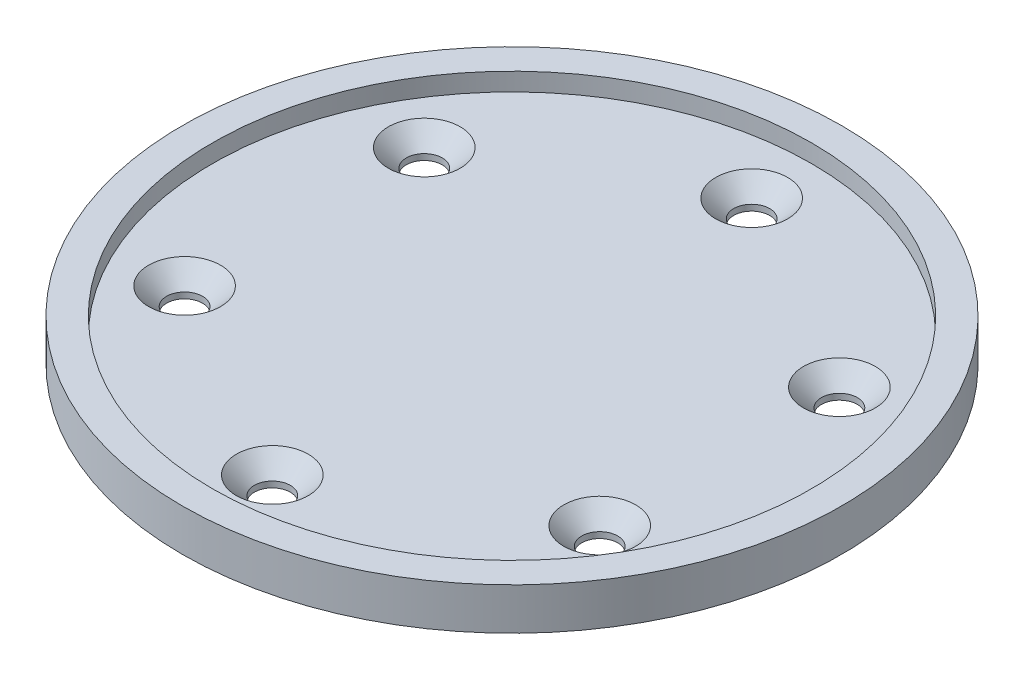
ISO-10303-21;
HEADER;
FILE_DESCRIPTION(('STEP AP214'),'2;1');
FILE_NAME('part.step','',(''),(''),'','','');
FILE_SCHEMA(('AUTOMOTIVE_DESIGN { 1 0 10303 214 1 1 1 1 }'));
ENDSEC;
DATA;
#1=APPLICATION_CONTEXT('core data for automotive mechanical design processes');
#2=APPLICATION_PROTOCOL_DEFINITION('international standard','automotive_design',2000,#1);
#3=PRODUCT_CONTEXT('',#1,'mechanical');
#4=PRODUCT('Part','Part','',(#3));
#5=PRODUCT_RELATED_PRODUCT_CATEGORY('part','',(#4));
#6=PRODUCT_DEFINITION_FORMATION('','',#4);
#7=PRODUCT_DEFINITION_CONTEXT('part definition',#1,'design');
#8=PRODUCT_DEFINITION('design','',#6,#7);
#9=PRODUCT_DEFINITION_SHAPE('','',#8);
#10=(LENGTH_UNIT() NAMED_UNIT(*) SI_UNIT(.MILLI.,.METRE.));
#11=(NAMED_UNIT(*) PLANE_ANGLE_UNIT() SI_UNIT($,.RADIAN.));
#12=(NAMED_UNIT(*) SI_UNIT($,.STERADIAN.) SOLID_ANGLE_UNIT());
#13=UNCERTAINTY_MEASURE_WITH_UNIT(LENGTH_MEASURE(1.E-05),#10,'distance_accuracy_value','');
#14=(GEOMETRIC_REPRESENTATION_CONTEXT(3) GLOBAL_UNCERTAINTY_ASSIGNED_CONTEXT((#13)) GLOBAL_UNIT_ASSIGNED_CONTEXT((#10,
#11,#12)) REPRESENTATION_CONTEXT('',''));
#15=CARTESIAN_POINT('',(0.,0.,0.));
#16=DIRECTION('',(0.,0.,1.));
#17=DIRECTION('',(1.,0.,0.));
#18=AXIS2_PLACEMENT_3D('',#15,#16,#17);
#19=CARTESIAN_POINT('',(50.,6.47864191507407,0.));
#20=DIRECTION('',(0.,1.,0.));
#21=DIRECTION('',(0.,0.,1.));
#22=AXIS2_PLACEMENT_3D('',#19,#20,#21);
#23=PLANE('',#22);
#24=CARTESIAN_POINT('',(0.,6.47864191507407,0.));
#25=DIRECTION('',(0.,-1.,0.));
#26=DIRECTION('',(0.,0.,-1.));
#27=AXIS2_PLACEMENT_3D('',#24,#25,#26);
#28=CIRCLE('',#27,50.);
#29=CARTESIAN_POINT('',(0.,6.47864191507407,-50.));
#30=VERTEX_POINT('',#29);
#31=EDGE_CURVE('E93',#30,#30,#28,.T.);
#32=ORIENTED_EDGE('',*,*,#31,.T.);
#33=EDGE_LOOP('',(#32));
#34=FACE_BOUND('',#33,.T.);
#35=CARTESIAN_POINT('',(0.,6.47864191507407,0.));
#36=DIRECTION('',(0.,-1.,0.));
#37=DIRECTION('',(0.,0.,-1.));
#38=AXIS2_PLACEMENT_3D('',#35,#36,#37);
#39=CIRCLE('',#38,55.);
#40=CARTESIAN_POINT('',(0.,6.47864191507407,-55.));
#41=VERTEX_POINT('',#40);
#42=EDGE_CURVE('E128',#41,#41,#39,.T.);
#43=ORIENTED_EDGE('',*,*,#42,.F.);
#44=EDGE_LOOP('',(#43));
#45=FACE_BOUND('',#44,.T.);
#46=ADVANCED_FACE('F50',(#34,#45),#23,.T.);
#47=CARTESIAN_POINT('',(0.,0.,0.));
#48=DIRECTION('',(0.,-1.,0.));
#49=DIRECTION('',(0.,0.,-1.));
#50=AXIS2_PLACEMENT_3D('',#47,#48,#49);
#51=CYLINDRICAL_SURFACE('',#50,50.);
#52=CARTESIAN_POINT('',(0.,3.47864191507407,0.));
#53=DIRECTION('',(0.,-1.,0.));
#54=DIRECTION('',(0.,0.,-1.));
#55=AXIS2_PLACEMENT_3D('',#52,#53,#54);
#56=CIRCLE('',#55,50.);
#57=CARTESIAN_POINT('',(0.,3.47864191507407,-50.));
#58=VERTEX_POINT('',#57);
#59=EDGE_CURVE('E140',#58,#58,#56,.T.);
#60=ORIENTED_EDGE('',*,*,#59,.T.);
#61=EDGE_LOOP('',(#60));
#62=FACE_BOUND('',#61,.T.);
#63=ORIENTED_EDGE('',*,*,#31,.F.);
#64=EDGE_LOOP('',(#63));
#65=FACE_BOUND('',#64,.T.);
#66=ADVANCED_FACE('F154',(#62,#65),#51,.F.);
#67=CARTESIAN_POINT('',(50.,3.47864191507406,0.));
#68=DIRECTION('',(0.,1.,0.));
#69=DIRECTION('',(0.,0.,1.));
#70=AXIS2_PLACEMENT_3D('',#67,#68,#69);
#71=PLANE('',#70);
#72=CARTESIAN_POINT('',(0.,3.47864191507406,-40.));
#73=DIRECTION('',(0.,1.,0.));
#74=DIRECTION('',(0.,0.,1.));
#75=AXIS2_PLACEMENT_3D('',#72,#73,#74);
#76=CIRCLE('',#75,6.00000000000001);
#77=CARTESIAN_POINT('',(0.,3.47864191507406,-34.));
#78=VERTEX_POINT('',#77);
#79=EDGE_CURVE('E114',#78,#78,#76,.F.);
#80=ORIENTED_EDGE('',*,*,#79,.T.);
#81=EDGE_LOOP('',(#80));
#82=FACE_BOUND('',#81,.T.);
#83=CARTESIAN_POINT('',(34.6410161513775,3.47864191507406,-20.));
#84=DIRECTION('',(0.,1.,0.));
#85=DIRECTION('',(0.,0.,1.));
#86=AXIS2_PLACEMENT_3D('',#83,#84,#85);
#87=CIRCLE('',#86,6.00000000000107);
#88=CARTESIAN_POINT('',(34.6410161513775,3.47864191507406,-13.9999999999989));
#89=VERTEX_POINT('',#88);
#90=EDGE_CURVE('E110',#89,#89,#87,.F.);
#91=ORIENTED_EDGE('',*,*,#90,.T.);
#92=EDGE_LOOP('',(#91));
#93=FACE_BOUND('',#92,.T.);
#94=CARTESIAN_POINT('',(34.6410161513776,3.47864191507406,20.));
#95=DIRECTION('',(0.,1.,0.));
#96=DIRECTION('',(0.,0.,1.));
#97=AXIS2_PLACEMENT_3D('',#94,#95,#96);
#98=CIRCLE('',#97,6.00000000000276);
#99=CARTESIAN_POINT('',(34.6410161513776,3.47864191507406,26.0000000000028));
#100=VERTEX_POINT('',#99);
#101=EDGE_CURVE('E106',#100,#100,#98,.F.);
#102=ORIENTED_EDGE('',*,*,#101,.T.);
#103=EDGE_LOOP('',(#102));
#104=FACE_BOUND('',#103,.T.);
#105=CARTESIAN_POINT('',(0.,3.47864191507406,40.));
#106=DIRECTION('',(0.,1.,0.));
#107=DIRECTION('',(0.,0.,1.));
#108=AXIS2_PLACEMENT_3D('',#105,#106,#107);
#109=CIRCLE('',#108,6.00000000000343);
#110=CARTESIAN_POINT('',(0.,3.47864191507406,46.0000000000034));
#111=VERTEX_POINT('',#110);
#112=EDGE_CURVE('E102',#111,#111,#109,.F.);
#113=ORIENTED_EDGE('',*,*,#112,.T.);
#114=EDGE_LOOP('',(#113));
#115=FACE_BOUND('',#114,.T.);
#116=CARTESIAN_POINT('',(-34.6410161513775,3.47864191507406,20.));
#117=DIRECTION('',(0.,1.,0.));
#118=DIRECTION('',(0.,0.,1.));
#119=AXIS2_PLACEMENT_3D('',#116,#117,#118);
#120=CIRCLE('',#119,6.00000000000236);
#121=CARTESIAN_POINT('',(-34.6410161513775,3.47864191507406,26.0000000000024));
#122=VERTEX_POINT('',#121);
#123=EDGE_CURVE('E98',#122,#122,#120,.F.);
#124=ORIENTED_EDGE('',*,*,#123,.T.);
#125=EDGE_LOOP('',(#124));
#126=FACE_BOUND('',#125,.T.);
#127=CARTESIAN_POINT('',(-34.6410161513776,3.47864191507406,-20.));
#128=DIRECTION('',(0.,1.,0.));
#129=DIRECTION('',(0.,0.,1.));
#130=AXIS2_PLACEMENT_3D('',#127,#128,#129);
#131=CIRCLE('',#130,6.00000000000069);
#132=CARTESIAN_POINT('',(-34.6410161513776,3.47864191507406,-13.9999999999993));
#133=VERTEX_POINT('',#132);
#134=EDGE_CURVE('E92',#133,#133,#131,.F.);
#135=ORIENTED_EDGE('',*,*,#134,.T.);
#136=EDGE_LOOP('',(#135));
#137=FACE_BOUND('',#136,.T.);
#138=ORIENTED_EDGE('',*,*,#59,.F.);
#139=EDGE_LOOP('',(#138));
#140=FACE_BOUND('',#139,.T.);
#141=ADVANCED_FACE('F156',(#82,#93,#104,#115,#126,#137,#140),#71,.T.);
#142=CARTESIAN_POINT('',(0.,-0.521358084925941,0.));
#143=DIRECTION('',(0.,-1.,0.));
#144=DIRECTION('',(0.,0.,-1.));
#145=AXIS2_PLACEMENT_3D('',#142,#143,#144);
#146=PLANE('',#145);
#147=CARTESIAN_POINT('',(0.,-0.521358084925941,-40.));
#148=DIRECTION('',(0.,1.,0.));
#149=DIRECTION('',(0.,0.,1.));
#150=AXIS2_PLACEMENT_3D('',#147,#148,#149);
#151=CIRCLE('',#150,3.);
#152=CARTESIAN_POINT('',(0.,-0.521358084925941,-37.));
#153=VERTEX_POINT('',#152);
#154=EDGE_CURVE('E134',#153,#153,#151,.T.);
#155=ORIENTED_EDGE('',*,*,#154,.T.);
#156=EDGE_LOOP('',(#155));
#157=FACE_BOUND('',#156,.T.);
#158=CARTESIAN_POINT('',(-34.6410161513776,-0.521358084925941,-20.));
#159=DIRECTION('',(0.,1.,0.));
#160=DIRECTION('',(0.,0.,1.));
#161=AXIS2_PLACEMENT_3D('',#158,#159,#160);
#162=CIRCLE('',#161,3.00000000000064);
#163=CARTESIAN_POINT('',(-34.6410161513776,-0.521358084925941,-16.9999999999993));
#164=VERTEX_POINT('',#163);
#165=EDGE_CURVE('E404',#164,#164,#162,.T.);
#166=ORIENTED_EDGE('',*,*,#165,.T.);
#167=EDGE_LOOP('',(#166));
#168=FACE_BOUND('',#167,.T.);
#169=CARTESIAN_POINT('',(-34.6410161513775,-0.521358084925941,20.));
#170=DIRECTION('',(0.,1.,0.));
#171=DIRECTION('',(0.,0.,1.));
#172=AXIS2_PLACEMENT_3D('',#169,#170,#171);
#173=CIRCLE('',#172,3.00000000000232);
#174=CARTESIAN_POINT('',(-34.6410161513775,-0.521358084925941,23.0000000000023));
#175=VERTEX_POINT('',#174);
#176=EDGE_CURVE('E135',#175,#175,#173,.T.);
#177=ORIENTED_EDGE('',*,*,#176,.T.);
#178=EDGE_LOOP('',(#177));
#179=FACE_BOUND('',#178,.T.);
#180=CARTESIAN_POINT('',(0.,-0.521358084925941,40.));
#181=DIRECTION('',(0.,1.,0.));
#182=DIRECTION('',(0.,0.,1.));
#183=AXIS2_PLACEMENT_3D('',#180,#181,#182);
#184=CIRCLE('',#183,3.00000000000339);
#185=CARTESIAN_POINT('',(0.,-0.521358084925941,43.0000000000034));
#186=VERTEX_POINT('',#185);
#187=EDGE_CURVE('E411',#186,#186,#184,.T.);
#188=ORIENTED_EDGE('',*,*,#187,.T.);
#189=EDGE_LOOP('',(#188));
#190=FACE_BOUND('',#189,.T.);
#191=CARTESIAN_POINT('',(34.6410161513776,-0.521358084925941,20.));
#192=DIRECTION('',(0.,1.,0.));
#193=DIRECTION('',(0.,0.,1.));
#194=AXIS2_PLACEMENT_3D('',#191,#192,#193);
#195=CIRCLE('',#194,3.00000000000276);
#196=CARTESIAN_POINT('',(34.6410161513776,-0.521358084925941,23.0000000000027));
#197=VERTEX_POINT('',#196);
#198=EDGE_CURVE('E415',#197,#197,#195,.T.);
#199=ORIENTED_EDGE('',*,*,#198,.T.);
#200=EDGE_LOOP('',(#199));
#201=FACE_BOUND('',#200,.T.);
#202=CARTESIAN_POINT('',(34.6410161513775,-0.521358084925941,-20.));
#203=DIRECTION('',(0.,1.,0.));
#204=DIRECTION('',(0.,0.,1.));
#205=AXIS2_PLACEMENT_3D('',#202,#203,#204);
#206=CIRCLE('',#205,3.00000000000104);
#207=CARTESIAN_POINT('',(34.6410161513775,-0.521358084925941,-16.999999999999));
#208=VERTEX_POINT('',#207);
#209=EDGE_CURVE('E293',#208,#208,#206,.T.);
#210=ORIENTED_EDGE('',*,*,#209,.T.);
#211=EDGE_LOOP('',(#210));
#212=FACE_BOUND('',#211,.T.);
#213=CARTESIAN_POINT('',(0.,-0.521358084925941,0.));
#214=DIRECTION('',(0.,-1.,0.));
#215=DIRECTION('',(0.,0.,-1.));
#216=AXIS2_PLACEMENT_3D('',#213,#214,#215);
#217=CIRCLE('',#216,55.);
#218=CARTESIAN_POINT('',(0.,-0.521358084925941,-55.));
#219=VERTEX_POINT('',#218);
#220=EDGE_CURVE('E133',#219,#219,#217,.T.);
#221=ORIENTED_EDGE('',*,*,#220,.T.);
#222=EDGE_LOOP('',(#221));
#223=FACE_BOUND('',#222,.T.);
#224=ADVANCED_FACE('F162',(#157,#168,#179,#190,#201,#212,#223),#146,.T.);
#225=CARTESIAN_POINT('',(0.,0.,0.));
#226=DIRECTION('',(0.,-1.,0.));
#227=DIRECTION('',(0.,0.,-1.));
#228=AXIS2_PLACEMENT_3D('',#225,#226,#227);
#229=CYLINDRICAL_SURFACE('',#228,55.);
#230=ORIENTED_EDGE('',*,*,#42,.T.);
#231=EDGE_LOOP('',(#230));
#232=FACE_BOUND('',#231,.T.);
#233=ORIENTED_EDGE('',*,*,#220,.F.);
#234=EDGE_LOOP('',(#233));
#235=FACE_BOUND('',#234,.T.);
#236=ADVANCED_FACE('F279',(#232,#235),#229,.T.);
#237=CARTESIAN_POINT('',(34.6410161513775,-0.521358084925941,-20.));
#238=DIRECTION('',(0.,1.,0.));
#239=DIRECTION('',(0.,0.,1.));
#240=AXIS2_PLACEMENT_3D('',#237,#238,#239);
#241=CYLINDRICAL_SURFACE('',#240,3.00000000000104);
#242=CARTESIAN_POINT('',(34.6410161513775,0.478641915074049,-20.));
#243=DIRECTION('',(0.,1.,0.));
#244=DIRECTION('',(0.,0.,1.));
#245=AXIS2_PLACEMENT_3D('',#242,#243,#244);
#246=CIRCLE('',#245,3.00000000000104);
#247=CARTESIAN_POINT('',(34.6410161513775,0.478641915074049,-16.999999999999));
#248=VERTEX_POINT('',#247);
#249=EDGE_CURVE('E118',#248,#248,#246,.T.);
#250=ORIENTED_EDGE('',*,*,#249,.T.);
#251=EDGE_LOOP('',(#250));
#252=FACE_BOUND('',#251,.T.);
#253=ORIENTED_EDGE('',*,*,#209,.F.);
#254=EDGE_LOOP('',(#253));
#255=FACE_BOUND('',#254,.T.);
#256=ADVANCED_FACE('F265',(#252,#255),#241,.F.);
#257=CARTESIAN_POINT('',(34.6410161513776,-0.521358084925941,20.));
#258=DIRECTION('',(0.,1.,0.));
#259=DIRECTION('',(0.,0.,1.));
#260=AXIS2_PLACEMENT_3D('',#257,#258,#259);
#261=CYLINDRICAL_SURFACE('',#260,3.00000000000276);
#262=CARTESIAN_POINT('',(34.6410161513776,0.478641915074067,20.));
#263=DIRECTION('',(0.,1.,0.));
#264=DIRECTION('',(0.,0.,1.));
#265=AXIS2_PLACEMENT_3D('',#262,#263,#264);
#266=CIRCLE('',#265,3.00000000000276);
#267=CARTESIAN_POINT('',(34.6410161513776,0.478641915074067,23.0000000000027));
#268=VERTEX_POINT('',#267);
#269=EDGE_CURVE('E72',#268,#268,#266,.T.);
#270=ORIENTED_EDGE('',*,*,#269,.T.);
#271=EDGE_LOOP('',(#270));
#272=FACE_BOUND('',#271,.T.);
#273=ORIENTED_EDGE('',*,*,#198,.F.);
#274=EDGE_LOOP('',(#273));
#275=FACE_BOUND('',#274,.T.);
#276=ADVANCED_FACE('F251',(#272,#275),#261,.F.);
#277=CARTESIAN_POINT('',(0.,-0.521358084925941,40.));
#278=DIRECTION('',(0.,1.,0.));
#279=DIRECTION('',(0.,0.,1.));
#280=AXIS2_PLACEMENT_3D('',#277,#278,#279);
#281=CYLINDRICAL_SURFACE('',#280,3.00000000000339);
#282=CARTESIAN_POINT('',(0.,0.478641915074034,40.));
#283=DIRECTION('',(0.,1.,0.));
#284=DIRECTION('',(0.,0.,1.));
#285=AXIS2_PLACEMENT_3D('',#282,#283,#284);
#286=CIRCLE('',#285,3.00000000000339);
#287=CARTESIAN_POINT('',(0.,0.478641915074034,43.0000000000034));
#288=VERTEX_POINT('',#287);
#289=EDGE_CURVE('E66',#288,#288,#286,.T.);
#290=ORIENTED_EDGE('',*,*,#289,.T.);
#291=EDGE_LOOP('',(#290));
#292=FACE_BOUND('',#291,.T.);
#293=ORIENTED_EDGE('',*,*,#187,.F.);
#294=EDGE_LOOP('',(#293));
#295=FACE_BOUND('',#294,.T.);
#296=ADVANCED_FACE('F238',(#292,#295),#281,.F.);
#297=CARTESIAN_POINT('',(-34.6410161513775,-0.521358084925941,20.));
#298=DIRECTION('',(0.,1.,0.));
#299=DIRECTION('',(0.,0.,1.));
#300=AXIS2_PLACEMENT_3D('',#297,#298,#299);
#301=CYLINDRICAL_SURFACE('',#300,3.00000000000232);
#302=CARTESIAN_POINT('',(-34.6410161513775,0.478641915074038,20.));
#303=DIRECTION('',(0.,1.,0.));
#304=DIRECTION('',(0.,0.,1.));
#305=AXIS2_PLACEMENT_3D('',#302,#303,#304);
#306=CIRCLE('',#305,3.00000000000232);
#307=CARTESIAN_POINT('',(-34.6410161513775,0.478641915074038,23.0000000000023));
#308=VERTEX_POINT('',#307);
#309=EDGE_CURVE('E60',#308,#308,#306,.T.);
#310=ORIENTED_EDGE('',*,*,#309,.T.);
#311=EDGE_LOOP('',(#310));
#312=FACE_BOUND('',#311,.T.);
#313=ORIENTED_EDGE('',*,*,#176,.F.);
#314=EDGE_LOOP('',(#313));
#315=FACE_BOUND('',#314,.T.);
#316=ADVANCED_FACE('F224',(#312,#315),#301,.F.);
#317=CARTESIAN_POINT('',(-34.6410161513776,-0.521358084925941,-20.));
#318=DIRECTION('',(0.,1.,0.));
#319=DIRECTION('',(0.,0.,1.));
#320=AXIS2_PLACEMENT_3D('',#317,#318,#319);
#321=CYLINDRICAL_SURFACE('',#320,3.00000000000064);
#322=CARTESIAN_POINT('',(-34.6410161513776,0.478641915074035,-20.));
#323=DIRECTION('',(0.,1.,0.));
#324=DIRECTION('',(0.,0.,1.));
#325=AXIS2_PLACEMENT_3D('',#322,#323,#324);
#326=CIRCLE('',#325,3.00000000000064);
#327=CARTESIAN_POINT('',(-34.6410161513776,0.478641915074035,-16.9999999999993));
#328=VERTEX_POINT('',#327);
#329=EDGE_CURVE('E11',#328,#328,#326,.T.);
#330=ORIENTED_EDGE('',*,*,#329,.T.);
#331=EDGE_LOOP('',(#330));
#332=FACE_BOUND('',#331,.T.);
#333=ORIENTED_EDGE('',*,*,#165,.F.);
#334=EDGE_LOOP('',(#333));
#335=FACE_BOUND('',#334,.T.);
#336=ADVANCED_FACE('F220',(#332,#335),#321,.F.);
#337=CARTESIAN_POINT('',(0.,-0.521358084925941,-40.));
#338=DIRECTION('',(0.,1.,0.));
#339=DIRECTION('',(0.,0.,1.));
#340=AXIS2_PLACEMENT_3D('',#337,#338,#339);
#341=CYLINDRICAL_SURFACE('',#340,3.);
#342=CARTESIAN_POINT('',(0.,0.478641915074062,-40.));
#343=DIRECTION('',(0.,1.,0.));
#344=DIRECTION('',(0.,0.,1.));
#345=AXIS2_PLACEMENT_3D('',#342,#343,#344);
#346=CIRCLE('',#345,3.);
#347=CARTESIAN_POINT('',(0.,0.478641915074062,-37.));
#348=VERTEX_POINT('',#347);
#349=EDGE_CURVE('E86',#348,#348,#346,.T.);
#350=ORIENTED_EDGE('',*,*,#349,.T.);
#351=EDGE_LOOP('',(#350));
#352=FACE_BOUND('',#351,.T.);
#353=ORIENTED_EDGE('',*,*,#154,.F.);
#354=EDGE_LOOP('',(#353));
#355=FACE_BOUND('',#354,.T.);
#356=ADVANCED_FACE('F176',(#352,#355),#341,.F.);
#357=CARTESIAN_POINT('',(0.,0.478641915074062,-40.));
#358=DIRECTION('',(0.,1.,0.));
#359=DIRECTION('',(0.,0.,1.));
#360=AXIS2_PLACEMENT_3D('',#357,#358,#359);
#361=CONICAL_SURFACE('',#360,3.,0.785398163397449);
#362=CARTESIAN_POINT('',(0.,3.47864191507406,-34.));
#363=CARTESIAN_POINT('',(0.,3.44739191507406,-34.03125));
#364=CARTESIAN_POINT('',(0.,3.41614191507406,-34.0625));
#365=CARTESIAN_POINT('',(0.,3.35364191507406,-34.125));
#366=CARTESIAN_POINT('',(0.,3.32239191507406,-34.15625));
#367=CARTESIAN_POINT('',(0.,3.25989191507406,-34.21875));
#368=CARTESIAN_POINT('',(0.,3.22864191507406,-34.25));
#369=CARTESIAN_POINT('',(0.,3.16614191507406,-34.3125));
#370=CARTESIAN_POINT('',(0.,3.13489191507406,-34.34375));
#371=CARTESIAN_POINT('',(0.,3.07239191507406,-34.40625));
#372=CARTESIAN_POINT('',(0.,3.04114191507406,-34.4375));
#373=CARTESIAN_POINT('',(0.,2.97864191507406,-34.5));
#374=CARTESIAN_POINT('',(0.,2.94739191507406,-34.53125));
#375=CARTESIAN_POINT('',(0.,2.88489191507406,-34.59375));
#376=CARTESIAN_POINT('',(0.,2.85364191507406,-34.625));
#377=CARTESIAN_POINT('',(0.,2.79114191507406,-34.6875));
#378=CARTESIAN_POINT('',(0.,2.75989191507406,-34.71875));
#379=CARTESIAN_POINT('',(0.,2.69739191507406,-34.78125));
#380=CARTESIAN_POINT('',(0.,2.66614191507406,-34.8125));
#381=CARTESIAN_POINT('',(0.,2.60364191507406,-34.875));
#382=CARTESIAN_POINT('',(0.,2.57239191507406,-34.90625));
#383=CARTESIAN_POINT('',(0.,2.50989191507406,-34.96875));
#384=CARTESIAN_POINT('',(0.,2.47864191507406,-35.));
#385=CARTESIAN_POINT('',(0.,2.41614191507406,-35.0625));
#386=CARTESIAN_POINT('',(0.,2.38489191507406,-35.09375));
#387=CARTESIAN_POINT('',(0.,2.32239191507406,-35.15625));
#388=CARTESIAN_POINT('',(0.,2.29114191507406,-35.1875));
#389=CARTESIAN_POINT('',(0.,2.22864191507406,-35.25));
#390=CARTESIAN_POINT('',(0.,2.19739191507406,-35.28125));
#391=CARTESIAN_POINT('',(0.,2.13489191507406,-35.34375));
#392=CARTESIAN_POINT('',(0.,2.10364191507406,-35.375));
#393=CARTESIAN_POINT('',(0.,2.04114191507406,-35.4375));
#394=CARTESIAN_POINT('',(0.,2.00989191507406,-35.46875));
#395=CARTESIAN_POINT('',(0.,1.94739191507406,-35.53125));
#396=CARTESIAN_POINT('',(0.,1.91614191507406,-35.5625));
#397=CARTESIAN_POINT('',(0.,1.85364191507406,-35.625));
#398=CARTESIAN_POINT('',(0.,1.82239191507406,-35.65625));
#399=CARTESIAN_POINT('',(0.,1.75989191507406,-35.71875));
#400=CARTESIAN_POINT('',(0.,1.72864191507406,-35.75));
#401=CARTESIAN_POINT('',(0.,1.66614191507406,-35.8125));
#402=CARTESIAN_POINT('',(0.,1.63489191507406,-35.84375));
#403=CARTESIAN_POINT('',(0.,1.57239191507406,-35.90625));
#404=CARTESIAN_POINT('',(0.,1.54114191507406,-35.9375));
#405=CARTESIAN_POINT('',(0.,1.47864191507406,-36.));
#406=CARTESIAN_POINT('',(0.,1.44739191507406,-36.03125));
#407=CARTESIAN_POINT('',(0.,1.38489191507406,-36.09375));
#408=CARTESIAN_POINT('',(0.,1.35364191507406,-36.125));
#409=CARTESIAN_POINT('',(0.,1.29114191507406,-36.1875));
#410=CARTESIAN_POINT('',(0.,1.25989191507406,-36.21875));
#411=CARTESIAN_POINT('',(0.,1.19739191507406,-36.28125));
#412=CARTESIAN_POINT('',(0.,1.16614191507406,-36.3125));
#413=CARTESIAN_POINT('',(0.,1.10364191507406,-36.375));
#414=CARTESIAN_POINT('',(0.,1.07239191507406,-36.40625));
#415=CARTESIAN_POINT('',(0.,1.00989191507406,-36.46875));
#416=CARTESIAN_POINT('',(0.,0.978641915074062,-36.5));
#417=CARTESIAN_POINT('',(0.,0.916141915074062,-36.5625));
#418=CARTESIAN_POINT('',(0.,0.884891915074062,-36.59375));
#419=CARTESIAN_POINT('',(0.,0.822391915074062,-36.65625));
#420=CARTESIAN_POINT('',(0.,0.791141915074063,-36.6875));
#421=CARTESIAN_POINT('',(0.,0.728641915074063,-36.75));
#422=CARTESIAN_POINT('',(0.,0.697391915074062,-36.78125));
#423=CARTESIAN_POINT('',(0.,0.634891915074061,-36.84375));
#424=CARTESIAN_POINT('',(0.,0.603641915074062,-36.875));
#425=CARTESIAN_POINT('',(0.,0.541141915074063,-36.9375));
#426=CARTESIAN_POINT('',(0.,0.509891915074064,-36.96875));
#427=CARTESIAN_POINT('',(0.,0.478641915074062,-37.));
#428=B_SPLINE_CURVE_WITH_KNOTS('',3,(#362,#363,#364,#365,#366,#367,#368,#369,#370,#371,#372,
#373,#374,#375,#376,#377,#378,#379,#380,#381,#382,#383,#384,#385,#386,#387,#388,#389,#390,#391,
#392,#393,#394,#395,#396,#397,#398,#399,#400,#401,#402,#403,#404,#405,#406,#407,#408,#409,#410,
#411,#412,#413,#414,#415,#416,#417,#418,#419,#420,#421,#422,#423,#424,#425,#426,#427),
.UNSPECIFIED.,.F.,.F.,(4,2,2,2,2,2,2,2,2,2,2,2,2,2,2,2,2,2,2,2,2,2,2,2,2,2,2,2,2,2,2,2,4),(0.,
0.13258252147248,0.265165042944956,0.397747564417431,0.530330085889911,0.662912607362391,
0.795495128834866,0.928077650307342,1.06066017177982,1.1932426932523,1.32582521472478,
1.45840773619725,1.59099025766973,1.72357277914221,1.85615530061469,1.98873782208716,
2.12132034355964,2.25390286503212,2.3864853865046,2.51906790797707,2.65165042944955,
2.78423295092203,2.91681547239451,3.04939799386699,3.18198051533947,3.31456303681195,
3.44714555828442,3.5797280797569,3.71231060122938,3.84489312270186,3.97747564417433,
4.11005816564681,4.24264068711929),.UNSPECIFIED.);
#429=EDGE_CURVE('BSEAM169',#78,#348,#428,.T.);
#430=ORIENTED_EDGE('',*,*,#79,.F.);
#431=ORIENTED_EDGE('',*,*,#349,.F.);
#432=ORIENTED_EDGE('',*,*,#429,.T.);
#433=ORIENTED_EDGE('',*,*,#429,.F.);
#434=EDGE_LOOP('',(#430,#432,#431,#433));
#435=FACE_BOUND('',#434,.T.);
#436=ADVANCED_FACE('F169',(#435),#361,.F.);
#437=CARTESIAN_POINT('',(34.6410161513775,0.478641915074049,-20.));
#438=DIRECTION('',(0.,1.,0.));
#439=DIRECTION('',(0.,0.,1.));
#440=AXIS2_PLACEMENT_3D('',#437,#438,#439);
#441=CONICAL_SURFACE('',#440,3.00000000000104,0.785398163397451);
#442=ORIENTED_EDGE('',*,*,#90,.F.);
#443=EDGE_LOOP('',(#442));
#444=FACE_BOUND('',#443,.T.);
#445=ORIENTED_EDGE('',*,*,#249,.F.);
#446=EDGE_LOOP('',(#445));
#447=FACE_BOUND('',#446,.T.);
#448=ADVANCED_FACE('F175',(#444,#447),#441,.F.);
#449=CARTESIAN_POINT('',(34.6410161513776,0.478641915074068,20.));
#450=DIRECTION('',(0.,1.,0.));
#451=DIRECTION('',(0.,0.,1.));
#452=AXIS2_PLACEMENT_3D('',#449,#450,#451);
#453=CONICAL_SURFACE('',#452,3.00000000000276,0.785398163397449);
#454=ORIENTED_EDGE('',*,*,#101,.F.);
#455=EDGE_LOOP('',(#454));
#456=FACE_BOUND('',#455,.T.);
#457=ORIENTED_EDGE('',*,*,#269,.F.);
#458=EDGE_LOOP('',(#457));
#459=FACE_BOUND('',#458,.T.);
#460=ADVANCED_FACE('F183',(#456,#459),#453,.F.);
#461=CARTESIAN_POINT('',(0.,0.478641915074034,40.));
#462=DIRECTION('',(0.,1.,0.));
#463=DIRECTION('',(0.,0.,1.));
#464=AXIS2_PLACEMENT_3D('',#461,#462,#463);
#465=CONICAL_SURFACE('',#464,3.00000000000339,0.785398163397451);
#466=ORIENTED_EDGE('',*,*,#112,.F.);
#467=EDGE_LOOP('',(#466));
#468=FACE_BOUND('',#467,.T.);
#469=ORIENTED_EDGE('',*,*,#289,.F.);
#470=EDGE_LOOP('',(#469));
#471=FACE_BOUND('',#470,.T.);
#472=ADVANCED_FACE('F190',(#468,#471),#465,.F.);
#473=CARTESIAN_POINT('',(-34.6410161513775,0.478641915074038,20.));
#474=DIRECTION('',(0.,1.,0.));
#475=DIRECTION('',(0.,0.,1.));
#476=AXIS2_PLACEMENT_3D('',#473,#474,#475);
#477=CONICAL_SURFACE('',#476,3.00000000000232,0.785398163397451);
#478=ORIENTED_EDGE('',*,*,#123,.F.);
#479=EDGE_LOOP('',(#478));
#480=FACE_BOUND('',#479,.T.);
#481=ORIENTED_EDGE('',*,*,#309,.F.);
#482=EDGE_LOOP('',(#481));
#483=FACE_BOUND('',#482,.T.);
#484=ADVANCED_FACE('F196',(#480,#483),#477,.F.);
#485=CARTESIAN_POINT('',(-34.6410161513776,0.478641915074035,-20.));
#486=DIRECTION('',(0.,1.,0.));
#487=DIRECTION('',(0.,0.,1.));
#488=AXIS2_PLACEMENT_3D('',#485,#486,#487);
#489=CONICAL_SURFACE('',#488,3.00000000000064,0.785398163397451);
#490=ORIENTED_EDGE('',*,*,#134,.F.);
#491=EDGE_LOOP('',(#490));
#492=FACE_BOUND('',#491,.T.);
#493=ORIENTED_EDGE('',*,*,#329,.F.);
#494=EDGE_LOOP('',(#493));
#495=FACE_BOUND('',#494,.T.);
#496=ADVANCED_FACE('F53',(#492,#495),#489,.F.);
#497=CLOSED_SHELL('',(#46,#66,#141,#224,#236,#256,#276,#296,#316,#336,#356,#436,#448,#460,#472,
#484,#496));
#498=MANIFOLD_SOLID_BREP('B2',#497);
#499=ADVANCED_BREP_SHAPE_REPRESENTATION('',(#18,#498),#14);
#500=SHAPE_DEFINITION_REPRESENTATION(#9,#499);
ENDSEC;
END-ISO-10303-21;
